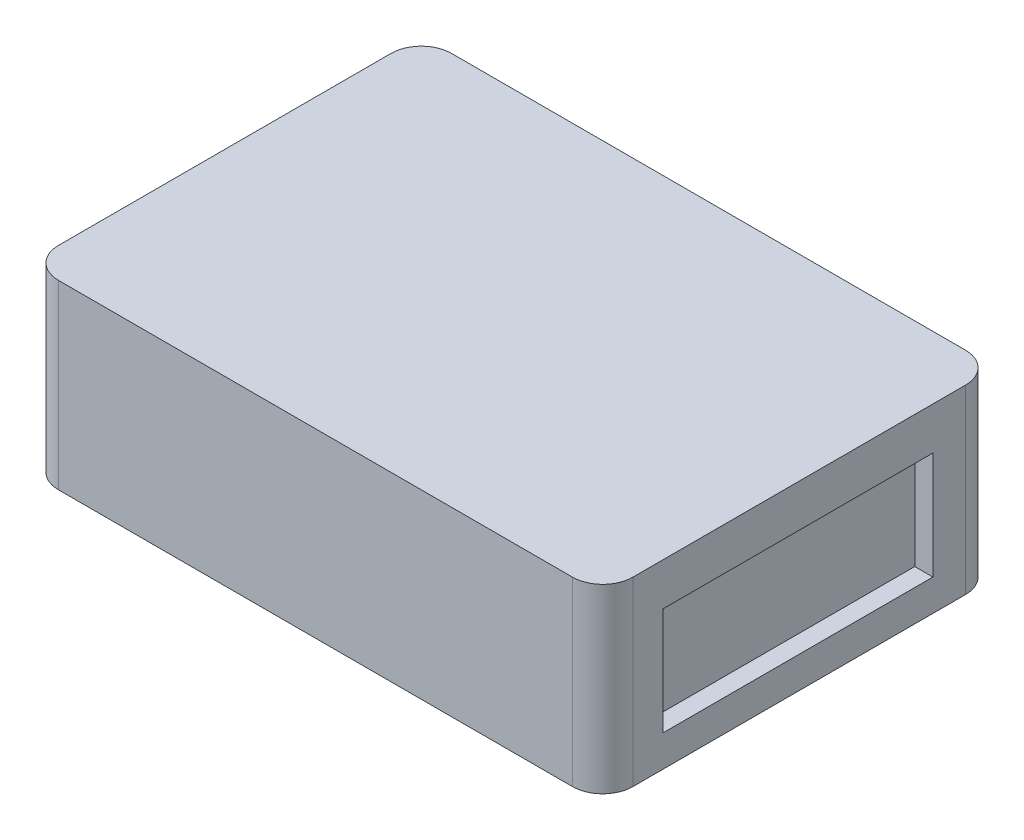
ISO-10303-21;
HEADER;
FILE_DESCRIPTION(('STEP AP214'),'2;1');
FILE_NAME('part.step','',(''),(''),'','','');
FILE_SCHEMA(('AUTOMOTIVE_DESIGN { 1 0 10303 214 1 1 1 1 }'));
ENDSEC;
DATA;
#1=APPLICATION_CONTEXT('core data for automotive mechanical design processes');
#2=APPLICATION_PROTOCOL_DEFINITION('international standard','automotive_design',2000,#1);
#3=PRODUCT_CONTEXT('',#1,'mechanical');
#4=PRODUCT('Part','Part','',(#3));
#5=PRODUCT_RELATED_PRODUCT_CATEGORY('part','',(#4));
#6=PRODUCT_DEFINITION_FORMATION('','',#4);
#7=PRODUCT_DEFINITION_CONTEXT('part definition',#1,'design');
#8=PRODUCT_DEFINITION('design','',#6,#7);
#9=PRODUCT_DEFINITION_SHAPE('','',#8);
#10=(LENGTH_UNIT() NAMED_UNIT(*) SI_UNIT(.MILLI.,.METRE.));
#11=(NAMED_UNIT(*) PLANE_ANGLE_UNIT() SI_UNIT($,.RADIAN.));
#12=(NAMED_UNIT(*) SI_UNIT($,.STERADIAN.) SOLID_ANGLE_UNIT());
#13=UNCERTAINTY_MEASURE_WITH_UNIT(LENGTH_MEASURE(1.E-05),#10,'distance_accuracy_value','');
#14=(GEOMETRIC_REPRESENTATION_CONTEXT(3) GLOBAL_UNCERTAINTY_ASSIGNED_CONTEXT((#13)) GLOBAL_UNIT_ASSIGNED_CONTEXT((#10,
#11,#12)) REPRESENTATION_CONTEXT('',''));
#15=CARTESIAN_POINT('',(0.,0.,0.));
#16=DIRECTION('',(0.,0.,1.));
#17=DIRECTION('',(1.,0.,0.));
#18=AXIS2_PLACEMENT_3D('',#15,#16,#17);
#19=CARTESIAN_POINT('',(47.5,30.,32.5));
#20=DIRECTION('',(-1.,0.,0.));
#21=DIRECTION('',(0.,0.,1.));
#22=AXIS2_PLACEMENT_3D('',#19,#20,#21);
#23=PLANE('',#22);
#24=DIRECTION('',(0.,0.,-1.));
#25=VECTOR('',#24,1.);
#26=CARTESIAN_POINT('',(47.5,5.21036770434952,22.5224648724796));
#27=LINE('',#26,#25);
#28=CARTESIAN_POINT('',(47.5,5.21036770434952,22.5224648724796));
#29=VERTEX_POINT('',#28);
#30=CARTESIAN_POINT('',(47.5,5.21036770434952,-22.1001857617545));
#31=VERTEX_POINT('',#30);
#32=EDGE_CURVE('E161',#29,#31,#27,.T.);
#33=ORIENTED_EDGE('',*,*,#32,.F.);
#34=DIRECTION('',(0.,-1.,0.));
#35=VECTOR('',#34,1.);
#36=CARTESIAN_POINT('',(47.5,22.9727820344815,22.5224648724796));
#37=LINE('',#36,#35);
#38=CARTESIAN_POINT('',(47.5,22.9727820344815,22.5224648724796));
#39=VERTEX_POINT('',#38);
#40=EDGE_CURVE('E58',#39,#29,#37,.T.);
#41=ORIENTED_EDGE('',*,*,#40,.F.);
#42=DIRECTION('',(0.,0.,1.));
#43=VECTOR('',#42,1.);
#44=CARTESIAN_POINT('',(47.5,22.9727820344815,22.5224648724796));
#45=LINE('',#44,#43);
#46=CARTESIAN_POINT('',(47.5,22.9727820344815,-22.1001857617545));
#47=VERTEX_POINT('',#46);
#48=EDGE_CURVE('E152',#47,#39,#45,.T.);
#49=ORIENTED_EDGE('',*,*,#48,.F.);
#50=DIRECTION('',(0.,1.,0.));
#51=VECTOR('',#50,1.);
#52=CARTESIAN_POINT('',(47.5,22.9727820344815,-22.1001857617545));
#53=LINE('',#52,#51);
#54=EDGE_CURVE('E155',#31,#47,#53,.T.);
#55=ORIENTED_EDGE('',*,*,#54,.F.);
#56=EDGE_LOOP('',(#33,#41,#49,#55));
#57=FACE_BOUND('',#56,.T.);
#58=DIRECTION('',(0.,0.,-1.));
#59=VECTOR('',#58,1.);
#60=CARTESIAN_POINT('',(47.5,0.,32.5));
#61=LINE('',#60,#59);
#62=CARTESIAN_POINT('',(47.5,0.,27.5));
#63=VERTEX_POINT('',#62);
#64=CARTESIAN_POINT('',(47.5,0.,-27.5));
#65=VERTEX_POINT('',#64);
#66=EDGE_CURVE('E192',#63,#65,#61,.T.);
#67=ORIENTED_EDGE('',*,*,#66,.T.);
#68=DIRECTION('',(0.,-1.,0.));
#69=VECTOR('',#68,1.);
#70=CARTESIAN_POINT('',(47.5,30.,-27.5));
#71=LINE('',#70,#69);
#72=CARTESIAN_POINT('',(47.5,30.,-27.5));
#73=VERTEX_POINT('',#72);
#74=EDGE_CURVE('E245',#65,#73,#71,.F.);
#75=ORIENTED_EDGE('',*,*,#74,.T.);
#76=DIRECTION('',(0.,0.,-1.));
#77=VECTOR('',#76,1.);
#78=CARTESIAN_POINT('',(47.5,30.,32.5));
#79=LINE('',#78,#77);
#80=CARTESIAN_POINT('',(47.5,30.,27.5));
#81=VERTEX_POINT('',#80);
#82=EDGE_CURVE('E195',#81,#73,#79,.T.);
#83=ORIENTED_EDGE('',*,*,#82,.F.);
#84=DIRECTION('',(0.,-1.,0.));
#85=VECTOR('',#84,1.);
#86=CARTESIAN_POINT('',(47.5,30.,27.5));
#87=LINE('',#86,#85);
#88=EDGE_CURVE('E242',#81,#63,#87,.T.);
#89=ORIENTED_EDGE('',*,*,#88,.T.);
#90=EDGE_LOOP('',(#67,#75,#83,#89));
#91=FACE_BOUND('',#90,.T.);
#92=ADVANCED_FACE('F43',(#57,#91),#23,.F.);
#93=CARTESIAN_POINT('',(-47.5,30.,-32.5));
#94=DIRECTION('',(0.,0.,1.));
#95=DIRECTION('',(1.,0.,0.));
#96=AXIS2_PLACEMENT_3D('',#93,#94,#95);
#97=PLANE('',#96);
#98=DIRECTION('',(-1.,0.,0.));
#99=VECTOR('',#98,1.);
#100=CARTESIAN_POINT('',(-47.5,0.,-32.5));
#101=LINE('',#100,#99);
#102=CARTESIAN_POINT('',(42.5,0.,-32.5));
#103=VERTEX_POINT('',#102);
#104=CARTESIAN_POINT('',(-42.5,0.,-32.5));
#105=VERTEX_POINT('',#104);
#106=EDGE_CURVE('E210',#103,#105,#101,.T.);
#107=ORIENTED_EDGE('',*,*,#106,.T.);
#108=DIRECTION('',(0.,-1.,0.));
#109=VECTOR('',#108,1.);
#110=CARTESIAN_POINT('',(-42.5,30.,-32.5));
#111=LINE('',#110,#109);
#112=CARTESIAN_POINT('',(-42.5,30.,-32.5));
#113=VERTEX_POINT('',#112);
#114=EDGE_CURVE('E232',#105,#113,#111,.F.);
#115=ORIENTED_EDGE('',*,*,#114,.T.);
#116=DIRECTION('',(-1.,0.,0.));
#117=VECTOR('',#116,1.);
#118=CARTESIAN_POINT('',(-47.5,30.,-32.5));
#119=LINE('',#118,#117);
#120=CARTESIAN_POINT('',(42.5,30.,-32.5));
#121=VERTEX_POINT('',#120);
#122=EDGE_CURVE('E198',#121,#113,#119,.T.);
#123=ORIENTED_EDGE('',*,*,#122,.F.);
#124=DIRECTION('',(0.,-1.,0.));
#125=VECTOR('',#124,1.);
#126=CARTESIAN_POINT('',(42.5,30.,-32.5));
#127=LINE('',#126,#125);
#128=EDGE_CURVE('E229',#121,#103,#127,.T.);
#129=ORIENTED_EDGE('',*,*,#128,.T.);
#130=EDGE_LOOP('',(#107,#115,#123,#129));
#131=FACE_BOUND('',#130,.T.);
#132=ADVANCED_FACE('F272',(#131),#97,.F.);
#133=CARTESIAN_POINT('',(-47.5,30.,32.5));
#134=DIRECTION('',(1.,0.,0.));
#135=DIRECTION('',(0.,0.,-1.));
#136=AXIS2_PLACEMENT_3D('',#133,#134,#135);
#137=PLANE('',#136);
#138=DIRECTION('',(0.,0.,1.));
#139=VECTOR('',#138,1.);
#140=CARTESIAN_POINT('',(-47.5,30.,32.5));
#141=LINE('',#140,#139);
#142=CARTESIAN_POINT('',(-47.5,30.,-27.5));
#143=VERTEX_POINT('',#142);
#144=CARTESIAN_POINT('',(-47.5,30.,27.5));
#145=VERTEX_POINT('',#144);
#146=EDGE_CURVE('E202',#143,#145,#141,.T.);
#147=ORIENTED_EDGE('',*,*,#146,.F.);
#148=DIRECTION('',(0.,-1.,0.));
#149=VECTOR('',#148,1.);
#150=CARTESIAN_POINT('',(-47.5,30.,-27.5));
#151=LINE('',#150,#149);
#152=CARTESIAN_POINT('',(-47.5,0.,-27.5));
#153=VERTEX_POINT('',#152);
#154=EDGE_CURVE('E218',#143,#153,#151,.T.);
#155=ORIENTED_EDGE('',*,*,#154,.T.);
#156=DIRECTION('',(0.,0.,1.));
#157=VECTOR('',#156,1.);
#158=CARTESIAN_POINT('',(-47.5,0.,32.5));
#159=LINE('',#158,#157);
#160=CARTESIAN_POINT('',(-47.5,0.,27.5));
#161=VERTEX_POINT('',#160);
#162=EDGE_CURVE('E213',#153,#161,#159,.T.);
#163=ORIENTED_EDGE('',*,*,#162,.T.);
#164=DIRECTION('',(0.,-1.,0.));
#165=VECTOR('',#164,1.);
#166=CARTESIAN_POINT('',(-47.5,30.,27.5));
#167=LINE('',#166,#165);
#168=EDGE_CURVE('E207',#161,#145,#167,.F.);
#169=ORIENTED_EDGE('',*,*,#168,.T.);
#170=EDGE_LOOP('',(#147,#155,#163,#169));
#171=FACE_BOUND('',#170,.T.);
#172=ADVANCED_FACE('F280',(#171),#137,.F.);
#173=CARTESIAN_POINT('',(-47.5,30.,32.5));
#174=DIRECTION('',(0.,0.,-1.));
#175=DIRECTION('',(-1.,0.,0.));
#176=AXIS2_PLACEMENT_3D('',#173,#174,#175);
#177=PLANE('',#176);
#178=DIRECTION('',(1.,0.,0.));
#179=VECTOR('',#178,1.);
#180=CARTESIAN_POINT('',(-47.5,0.,32.5));
#181=LINE('',#180,#179);
#182=CARTESIAN_POINT('',(-42.5,0.,32.5));
#183=VERTEX_POINT('',#182);
#184=CARTESIAN_POINT('',(42.5,0.,32.5));
#185=VERTEX_POINT('',#184);
#186=EDGE_CURVE('E199',#183,#185,#181,.T.);
#187=ORIENTED_EDGE('',*,*,#186,.T.);
#188=DIRECTION('',(0.,-1.,0.));
#189=VECTOR('',#188,1.);
#190=CARTESIAN_POINT('',(42.5,30.,32.5));
#191=LINE('',#190,#189);
#192=CARTESIAN_POINT('',(42.5,30.,32.5));
#193=VERTEX_POINT('',#192);
#194=EDGE_CURVE('E11',#185,#193,#191,.F.);
#195=ORIENTED_EDGE('',*,*,#194,.T.);
#196=DIRECTION('',(1.,0.,0.));
#197=VECTOR('',#196,1.);
#198=CARTESIAN_POINT('',(-47.5,30.,32.5));
#199=LINE('',#198,#197);
#200=CARTESIAN_POINT('',(-42.5,30.,32.5));
#201=VERTEX_POINT('',#200);
#202=EDGE_CURVE('E205',#201,#193,#199,.T.);
#203=ORIENTED_EDGE('',*,*,#202,.F.);
#204=DIRECTION('',(0.,-1.,0.));
#205=VECTOR('',#204,1.);
#206=CARTESIAN_POINT('',(-42.5,30.,32.5));
#207=LINE('',#206,#205);
#208=EDGE_CURVE('E51',#201,#183,#207,.T.);
#209=ORIENTED_EDGE('',*,*,#208,.T.);
#210=EDGE_LOOP('',(#187,#195,#203,#209));
#211=FACE_BOUND('',#210,.T.);
#212=ADVANCED_FACE('F249',(#211),#177,.F.);
#213=CARTESIAN_POINT('',(0.,30.,0.));
#214=DIRECTION('',(0.,-1.,0.));
#215=DIRECTION('',(0.,0.,-1.));
#216=AXIS2_PLACEMENT_3D('',#213,#214,#215);
#217=PLANE('',#216);
#218=ORIENTED_EDGE('',*,*,#122,.T.);
#219=CARTESIAN_POINT('',(-42.5,30.,-27.5));
#220=DIRECTION('',(0.,-1.,0.));
#221=DIRECTION('',(0.,0.,-1.));
#222=AXIS2_PLACEMENT_3D('',#219,#220,#221);
#223=CIRCLE('',#222,5.);
#224=EDGE_CURVE('E240',#113,#143,#223,.F.);
#225=ORIENTED_EDGE('',*,*,#224,.T.);
#226=ORIENTED_EDGE('',*,*,#146,.T.);
#227=CARTESIAN_POINT('',(-42.5,30.,27.5));
#228=DIRECTION('',(0.,-1.,0.));
#229=DIRECTION('',(0.,0.,-1.));
#230=AXIS2_PLACEMENT_3D('',#227,#228,#229);
#231=CIRCLE('',#230,5.);
#232=EDGE_CURVE('E234',#145,#201,#231,.F.);
#233=ORIENTED_EDGE('',*,*,#232,.T.);
#234=ORIENTED_EDGE('',*,*,#202,.T.);
#235=CARTESIAN_POINT('',(42.5,30.,27.5));
#236=DIRECTION('',(0.,-1.,0.));
#237=DIRECTION('',(0.,0.,-1.));
#238=AXIS2_PLACEMENT_3D('',#235,#236,#237);
#239=CIRCLE('',#238,5.);
#240=EDGE_CURVE('E236',#193,#81,#239,.F.);
#241=ORIENTED_EDGE('',*,*,#240,.T.);
#242=ORIENTED_EDGE('',*,*,#82,.T.);
#243=CARTESIAN_POINT('',(42.5,30.,-27.5));
#244=DIRECTION('',(0.,-1.,0.));
#245=DIRECTION('',(0.,0.,-1.));
#246=AXIS2_PLACEMENT_3D('',#243,#244,#245);
#247=CIRCLE('',#246,5.);
#248=EDGE_CURVE('E238',#73,#121,#247,.F.);
#249=ORIENTED_EDGE('',*,*,#248,.T.);
#250=EDGE_LOOP('',(#218,#225,#226,#233,#234,#241,#242,#249));
#251=FACE_BOUND('',#250,.T.);
#252=ADVANCED_FACE('F265',(#251),#217,.F.);
#253=CARTESIAN_POINT('',(0.,0.,0.));
#254=DIRECTION('',(0.,-1.,0.));
#255=DIRECTION('',(0.,0.,-1.));
#256=AXIS2_PLACEMENT_3D('',#253,#254,#255);
#257=PLANE('',#256);
#258=CARTESIAN_POINT('',(-40.6617200844704,0.,-23.));
#259=DIRECTION('',(0.,-1.,0.));
#260=DIRECTION('',(0.,0.,-1.));
#261=AXIS2_PLACEMENT_3D('',#258,#259,#260);
#262=CIRCLE('',#261,1.5);
#263=CARTESIAN_POINT('',(-40.6617200844704,0.,-24.5));
#264=VERTEX_POINT('',#263);
#265=EDGE_CURVE('E177',#264,#264,#262,.T.);
#266=ORIENTED_EDGE('',*,*,#265,.F.);
#267=EDGE_LOOP('',(#266));
#268=FACE_BOUND('',#267,.T.);
#269=CARTESIAN_POINT('',(14.3382799155296,0.,23.));
#270=DIRECTION('',(0.,-1.,0.));
#271=DIRECTION('',(0.,0.,-1.));
#272=AXIS2_PLACEMENT_3D('',#269,#270,#271);
#273=CIRCLE('',#272,1.5);
#274=CARTESIAN_POINT('',(14.3382799155296,0.,21.5));
#275=VERTEX_POINT('',#274);
#276=EDGE_CURVE('E184',#275,#275,#273,.T.);
#277=ORIENTED_EDGE('',*,*,#276,.F.);
#278=EDGE_LOOP('',(#277));
#279=FACE_BOUND('',#278,.T.);
#280=CARTESIAN_POINT('',(14.3382799155296,0.,-23.));
#281=DIRECTION('',(0.,-1.,0.));
#282=DIRECTION('',(0.,0.,-1.));
#283=AXIS2_PLACEMENT_3D('',#280,#281,#282);
#284=CIRCLE('',#283,1.5);
#285=CARTESIAN_POINT('',(14.3382799155296,0.,-24.5));
#286=VERTEX_POINT('',#285);
#287=EDGE_CURVE('E171',#286,#286,#284,.T.);
#288=ORIENTED_EDGE('',*,*,#287,.F.);
#289=EDGE_LOOP('',(#288));
#290=FACE_BOUND('',#289,.T.);
#291=CARTESIAN_POINT('',(-40.6617200844704,0.,23.));
#292=DIRECTION('',(0.,-1.,0.));
#293=DIRECTION('',(0.,0.,-1.));
#294=AXIS2_PLACEMENT_3D('',#291,#292,#293);
#295=CIRCLE('',#294,1.5);
#296=CARTESIAN_POINT('',(-40.6617200844704,0.,21.5));
#297=VERTEX_POINT('',#296);
#298=EDGE_CURVE('E180',#297,#297,#295,.T.);
#299=ORIENTED_EDGE('',*,*,#298,.F.);
#300=EDGE_LOOP('',(#299));
#301=FACE_BOUND('',#300,.T.);
#302=ORIENTED_EDGE('',*,*,#162,.F.);
#303=CARTESIAN_POINT('',(-42.5,0.,-27.5));
#304=DIRECTION('',(0.,-1.,0.));
#305=DIRECTION('',(0.,0.,-1.));
#306=AXIS2_PLACEMENT_3D('',#303,#304,#305);
#307=CIRCLE('',#306,5.);
#308=EDGE_CURVE('E227',#153,#105,#307,.T.);
#309=ORIENTED_EDGE('',*,*,#308,.T.);
#310=ORIENTED_EDGE('',*,*,#106,.F.);
#311=CARTESIAN_POINT('',(42.5,0.,-27.5));
#312=DIRECTION('',(0.,-1.,0.));
#313=DIRECTION('',(0.,0.,-1.));
#314=AXIS2_PLACEMENT_3D('',#311,#312,#313);
#315=CIRCLE('',#314,5.);
#316=EDGE_CURVE('E225',#103,#65,#315,.T.);
#317=ORIENTED_EDGE('',*,*,#316,.T.);
#318=ORIENTED_EDGE('',*,*,#66,.F.);
#319=CARTESIAN_POINT('',(42.5,0.,27.5));
#320=DIRECTION('',(0.,-1.,0.));
#321=DIRECTION('',(0.,0.,-1.));
#322=AXIS2_PLACEMENT_3D('',#319,#320,#321);
#323=CIRCLE('',#322,5.);
#324=EDGE_CURVE('E223',#63,#185,#323,.T.);
#325=ORIENTED_EDGE('',*,*,#324,.T.);
#326=ORIENTED_EDGE('',*,*,#186,.F.);
#327=CARTESIAN_POINT('',(-42.5,0.,27.5));
#328=DIRECTION('',(0.,-1.,0.));
#329=DIRECTION('',(0.,0.,-1.));
#330=AXIS2_PLACEMENT_3D('',#327,#328,#329);
#331=CIRCLE('',#330,5.);
#332=EDGE_CURVE('E221',#183,#161,#331,.T.);
#333=ORIENTED_EDGE('',*,*,#332,.T.);
#334=EDGE_LOOP('',(#302,#309,#310,#317,#318,#325,#326,#333));
#335=FACE_BOUND('',#334,.T.);
#336=ADVANCED_FACE('F254',(#268,#279,#290,#301,#335),#257,.T.);
#337=CARTESIAN_POINT('',(-42.5,30.,-27.5));
#338=DIRECTION('',(0.,-1.,0.));
#339=DIRECTION('',(0.,0.,-1.));
#340=AXIS2_PLACEMENT_3D('',#337,#338,#339);
#341=CYLINDRICAL_SURFACE('',#340,5.);
#342=ORIENTED_EDGE('',*,*,#224,.F.);
#343=ORIENTED_EDGE('',*,*,#114,.F.);
#344=ORIENTED_EDGE('',*,*,#308,.F.);
#345=ORIENTED_EDGE('',*,*,#154,.F.);
#346=EDGE_LOOP('',(#342,#343,#344,#345));
#347=FACE_BOUND('',#346,.T.);
#348=ADVANCED_FACE('F277',(#347),#341,.T.);
#349=CARTESIAN_POINT('',(42.5,30.,-27.5));
#350=DIRECTION('',(0.,-1.,0.));
#351=DIRECTION('',(0.,0.,-1.));
#352=AXIS2_PLACEMENT_3D('',#349,#350,#351);
#353=CYLINDRICAL_SURFACE('',#352,5.);
#354=ORIENTED_EDGE('',*,*,#248,.F.);
#355=ORIENTED_EDGE('',*,*,#74,.F.);
#356=ORIENTED_EDGE('',*,*,#316,.F.);
#357=ORIENTED_EDGE('',*,*,#128,.F.);
#358=EDGE_LOOP('',(#354,#355,#356,#357));
#359=FACE_BOUND('',#358,.T.);
#360=ADVANCED_FACE('F269',(#359),#353,.T.);
#361=CARTESIAN_POINT('',(42.5,30.,27.5));
#362=DIRECTION('',(0.,-1.,0.));
#363=DIRECTION('',(0.,0.,-1.));
#364=AXIS2_PLACEMENT_3D('',#361,#362,#363);
#365=CYLINDRICAL_SURFACE('',#364,5.);
#366=ORIENTED_EDGE('',*,*,#240,.F.);
#367=ORIENTED_EDGE('',*,*,#194,.F.);
#368=ORIENTED_EDGE('',*,*,#324,.F.);
#369=ORIENTED_EDGE('',*,*,#88,.F.);
#370=EDGE_LOOP('',(#366,#367,#368,#369));
#371=FACE_BOUND('',#370,.T.);
#372=ADVANCED_FACE('F259',(#371),#365,.T.);
#373=CARTESIAN_POINT('',(-42.5,30.,27.5));
#374=DIRECTION('',(0.,-1.,0.));
#375=DIRECTION('',(0.,0.,-1.));
#376=AXIS2_PLACEMENT_3D('',#373,#374,#375);
#377=CYLINDRICAL_SURFACE('',#376,5.);
#378=ORIENTED_EDGE('',*,*,#232,.F.);
#379=ORIENTED_EDGE('',*,*,#168,.F.);
#380=ORIENTED_EDGE('',*,*,#332,.F.);
#381=ORIENTED_EDGE('',*,*,#208,.F.);
#382=EDGE_LOOP('',(#378,#379,#380,#381));
#383=FACE_BOUND('',#382,.T.);
#384=ADVANCED_FACE('F45',(#383),#377,.T.);
#385=CARTESIAN_POINT('',(-40.6617200844704,10.,23.));
#386=DIRECTION('',(0.,-1.,0.));
#387=DIRECTION('',(0.,0.,-1.));
#388=AXIS2_PLACEMENT_3D('',#385,#386,#387);
#389=CYLINDRICAL_SURFACE('',#388,1.5);
#390=CARTESIAN_POINT('',(-40.6617200844704,10.,23.));
#391=DIRECTION('',(0.,-1.,0.));
#392=DIRECTION('',(0.,0.,-1.));
#393=AXIS2_PLACEMENT_3D('',#390,#391,#392);
#394=CIRCLE('',#393,1.5);
#395=CARTESIAN_POINT('',(-40.6617200844704,10.,21.5));
#396=VERTEX_POINT('',#395);
#397=EDGE_CURVE('E189',#396,#396,#394,.T.);
#398=ORIENTED_EDGE('',*,*,#397,.F.);
#399=EDGE_LOOP('',(#398));
#400=FACE_BOUND('',#399,.T.);
#401=ORIENTED_EDGE('',*,*,#298,.T.);
#402=EDGE_LOOP('',(#401));
#403=FACE_BOUND('',#402,.T.);
#404=ADVANCED_FACE('F283',(#400,#403),#389,.F.);
#405=CARTESIAN_POINT('',(-40.6617200844704,10.,23.));
#406=DIRECTION('',(0.,-1.,0.));
#407=DIRECTION('',(0.,0.,-1.));
#408=AXIS2_PLACEMENT_3D('',#405,#406,#407);
#409=PLANE('',#408);
#410=ORIENTED_EDGE('',*,*,#397,.T.);
#411=EDGE_LOOP('',(#410));
#412=FACE_BOUND('',#411,.T.);
#413=ADVANCED_FACE('F289',(#412),#409,.T.);
#414=CARTESIAN_POINT('',(14.3382799155296,10.,-23.));
#415=DIRECTION('',(0.,-1.,0.));
#416=DIRECTION('',(0.,0.,-1.));
#417=AXIS2_PLACEMENT_3D('',#414,#415,#416);
#418=CYLINDRICAL_SURFACE('',#417,1.5);
#419=CARTESIAN_POINT('',(14.3382799155296,10.,-23.));
#420=DIRECTION('',(0.,-1.,0.));
#421=DIRECTION('',(0.,0.,-1.));
#422=AXIS2_PLACEMENT_3D('',#419,#420,#421);
#423=CIRCLE('',#422,1.5);
#424=CARTESIAN_POINT('',(14.3382799155296,10.,-24.5));
#425=VERTEX_POINT('',#424);
#426=EDGE_CURVE('E167',#425,#425,#423,.T.);
#427=ORIENTED_EDGE('',*,*,#426,.F.);
#428=EDGE_LOOP('',(#427));
#429=FACE_BOUND('',#428,.T.);
#430=ORIENTED_EDGE('',*,*,#287,.T.);
#431=EDGE_LOOP('',(#430));
#432=FACE_BOUND('',#431,.T.);
#433=ADVANCED_FACE('F336',(#429,#432),#418,.F.);
#434=CARTESIAN_POINT('',(14.3382799155296,10.,-23.));
#435=DIRECTION('',(0.,-1.,0.));
#436=DIRECTION('',(0.,0.,-1.));
#437=AXIS2_PLACEMENT_3D('',#434,#435,#436);
#438=PLANE('',#437);
#439=ORIENTED_EDGE('',*,*,#426,.T.);
#440=EDGE_LOOP('',(#439));
#441=FACE_BOUND('',#440,.T.);
#442=ADVANCED_FACE('F346',(#441),#438,.T.);
#443=CARTESIAN_POINT('',(14.3382799155296,10.,23.));
#444=DIRECTION('',(0.,-1.,0.));
#445=DIRECTION('',(0.,0.,-1.));
#446=AXIS2_PLACEMENT_3D('',#443,#444,#445);
#447=CYLINDRICAL_SURFACE('',#446,1.5);
#448=CARTESIAN_POINT('',(14.3382799155296,10.,23.));
#449=DIRECTION('',(0.,-1.,0.));
#450=DIRECTION('',(0.,0.,-1.));
#451=AXIS2_PLACEMENT_3D('',#448,#449,#450);
#452=CIRCLE('',#451,1.5);
#453=CARTESIAN_POINT('',(14.3382799155296,10.,21.5));
#454=VERTEX_POINT('',#453);
#455=EDGE_CURVE('E174',#454,#454,#452,.T.);
#456=ORIENTED_EDGE('',*,*,#455,.F.);
#457=EDGE_LOOP('',(#456));
#458=FACE_BOUND('',#457,.T.);
#459=ORIENTED_EDGE('',*,*,#276,.T.);
#460=EDGE_LOOP('',(#459));
#461=FACE_BOUND('',#460,.T.);
#462=ADVANCED_FACE('F356',(#458,#461),#447,.F.);
#463=CARTESIAN_POINT('',(14.3382799155296,10.,23.));
#464=DIRECTION('',(0.,-1.,0.));
#465=DIRECTION('',(0.,0.,-1.));
#466=AXIS2_PLACEMENT_3D('',#463,#464,#465);
#467=PLANE('',#466);
#468=ORIENTED_EDGE('',*,*,#455,.T.);
#469=EDGE_LOOP('',(#468));
#470=FACE_BOUND('',#469,.T.);
#471=ADVANCED_FACE('F366',(#470),#467,.T.);
#472=CARTESIAN_POINT('',(-40.6617200844704,10.,-23.));
#473=DIRECTION('',(0.,-1.,0.));
#474=DIRECTION('',(0.,0.,-1.));
#475=AXIS2_PLACEMENT_3D('',#472,#473,#474);
#476=CYLINDRICAL_SURFACE('',#475,1.5);
#477=CARTESIAN_POINT('',(-40.6617200844704,10.,-23.));
#478=DIRECTION('',(0.,-1.,0.));
#479=DIRECTION('',(0.,0.,-1.));
#480=AXIS2_PLACEMENT_3D('',#477,#478,#479);
#481=CIRCLE('',#480,1.5);
#482=CARTESIAN_POINT('',(-40.6617200844704,10.,-24.5));
#483=VERTEX_POINT('',#482);
#484=EDGE_CURVE('E181',#483,#483,#481,.T.);
#485=ORIENTED_EDGE('',*,*,#484,.F.);
#486=EDGE_LOOP('',(#485));
#487=FACE_BOUND('',#486,.T.);
#488=ORIENTED_EDGE('',*,*,#265,.T.);
#489=EDGE_LOOP('',(#488));
#490=FACE_BOUND('',#489,.T.);
#491=ADVANCED_FACE('F376',(#487,#490),#476,.F.);
#492=CARTESIAN_POINT('',(-40.6617200844704,10.,-23.));
#493=DIRECTION('',(0.,-1.,0.));
#494=DIRECTION('',(0.,0.,-1.));
#495=AXIS2_PLACEMENT_3D('',#492,#493,#494);
#496=PLANE('',#495);
#497=ORIENTED_EDGE('',*,*,#484,.T.);
#498=EDGE_LOOP('',(#497));
#499=FACE_BOUND('',#498,.T.);
#500=ADVANCED_FACE('F386',(#499),#496,.T.);
#501=CARTESIAN_POINT('',(44.5,22.9727820344815,22.5224648724796));
#502=DIRECTION('',(0.,0.,1.));
#503=DIRECTION('',(1.,0.,0.));
#504=AXIS2_PLACEMENT_3D('',#501,#502,#503);
#505=PLANE('',#504);
#506=ORIENTED_EDGE('',*,*,#40,.T.);
#507=DIRECTION('',(1.,0.,0.));
#508=VECTOR('',#507,1.);
#509=CARTESIAN_POINT('',(44.5,5.21036770434952,22.5224648724796));
#510=LINE('',#509,#508);
#511=CARTESIAN_POINT('',(44.5,5.21036770434952,22.5224648724796));
#512=VERTEX_POINT('',#511);
#513=EDGE_CURVE('E130',#512,#29,#510,.T.);
#514=ORIENTED_EDGE('',*,*,#513,.F.);
#515=DIRECTION('',(0.,-1.,0.));
#516=VECTOR('',#515,1.);
#517=CARTESIAN_POINT('',(44.5,22.9727820344815,22.5224648724796));
#518=LINE('',#517,#516);
#519=CARTESIAN_POINT('',(44.5,22.9727820344815,22.5224648724796));
#520=VERTEX_POINT('',#519);
#521=EDGE_CURVE('E134',#520,#512,#518,.T.);
#522=ORIENTED_EDGE('',*,*,#521,.F.);
#523=DIRECTION('',(1.,0.,0.));
#524=VECTOR('',#523,1.);
#525=CARTESIAN_POINT('',(44.5,22.9727820344815,22.5224648724796));
#526=LINE('',#525,#524);
#527=EDGE_CURVE('E165',#520,#39,#526,.T.);
#528=ORIENTED_EDGE('',*,*,#527,.T.);
#529=EDGE_LOOP('',(#506,#514,#522,#528));
#530=FACE_BOUND('',#529,.T.);
#531=ADVANCED_FACE('F132',(#530),#505,.F.);
#532=CARTESIAN_POINT('',(44.5,22.9727820344815,22.5224648724796));
#533=DIRECTION('',(0.,1.,0.));
#534=DIRECTION('',(0.,0.,1.));
#535=AXIS2_PLACEMENT_3D('',#532,#533,#534);
#536=PLANE('',#535);
#537=ORIENTED_EDGE('',*,*,#48,.T.);
#538=ORIENTED_EDGE('',*,*,#527,.F.);
#539=DIRECTION('',(0.,0.,1.));
#540=VECTOR('',#539,1.);
#541=CARTESIAN_POINT('',(44.5,22.9727820344815,22.5224648724796));
#542=LINE('',#541,#540);
#543=CARTESIAN_POINT('',(44.5,22.9727820344815,-22.1001857617545));
#544=VERTEX_POINT('',#543);
#545=EDGE_CURVE('E140',#544,#520,#542,.T.);
#546=ORIENTED_EDGE('',*,*,#545,.F.);
#547=DIRECTION('',(1.,0.,0.));
#548=VECTOR('',#547,1.);
#549=CARTESIAN_POINT('',(44.5,22.9727820344815,-22.1001857617545));
#550=LINE('',#549,#548);
#551=EDGE_CURVE('E168',#544,#47,#550,.T.);
#552=ORIENTED_EDGE('',*,*,#551,.T.);
#553=EDGE_LOOP('',(#537,#538,#546,#552));
#554=FACE_BOUND('',#553,.T.);
#555=ADVANCED_FACE('F403',(#554),#536,.F.);
#556=CARTESIAN_POINT('',(44.5,22.9727820344815,-22.1001857617545));
#557=DIRECTION('',(0.,0.,-1.));
#558=DIRECTION('',(-1.,0.,0.));
#559=AXIS2_PLACEMENT_3D('',#556,#557,#558);
#560=PLANE('',#559);
#561=ORIENTED_EDGE('',*,*,#54,.T.);
#562=ORIENTED_EDGE('',*,*,#551,.F.);
#563=DIRECTION('',(0.,1.,0.));
#564=VECTOR('',#563,1.);
#565=CARTESIAN_POINT('',(44.5,22.9727820344815,-22.1001857617545));
#566=LINE('',#565,#564);
#567=CARTESIAN_POINT('',(44.5,5.21036770434952,-22.1001857617545));
#568=VERTEX_POINT('',#567);
#569=EDGE_CURVE('E148',#568,#544,#566,.T.);
#570=ORIENTED_EDGE('',*,*,#569,.F.);
#571=DIRECTION('',(1.,0.,0.));
#572=VECTOR('',#571,1.);
#573=CARTESIAN_POINT('',(44.5,5.21036770434952,-22.1001857617545));
#574=LINE('',#573,#572);
#575=EDGE_CURVE('E139',#568,#31,#574,.T.);
#576=ORIENTED_EDGE('',*,*,#575,.T.);
#577=EDGE_LOOP('',(#561,#562,#570,#576));
#578=FACE_BOUND('',#577,.T.);
#579=ADVANCED_FACE('F412',(#578),#560,.F.);
#580=CARTESIAN_POINT('',(44.5,5.21036770434952,22.5224648724796));
#581=DIRECTION('',(0.,-1.,0.));
#582=DIRECTION('',(0.,0.,-1.));
#583=AXIS2_PLACEMENT_3D('',#580,#581,#582);
#584=PLANE('',#583);
#585=ORIENTED_EDGE('',*,*,#32,.T.);
#586=ORIENTED_EDGE('',*,*,#575,.F.);
#587=DIRECTION('',(0.,0.,-1.));
#588=VECTOR('',#587,1.);
#589=CARTESIAN_POINT('',(44.5,5.21036770434952,22.5224648724796));
#590=LINE('',#589,#588);
#591=EDGE_CURVE('E143',#512,#568,#590,.T.);
#592=ORIENTED_EDGE('',*,*,#591,.F.);
#593=ORIENTED_EDGE('',*,*,#513,.T.);
#594=EDGE_LOOP('',(#585,#586,#592,#593));
#595=FACE_BOUND('',#594,.T.);
#596=ADVANCED_FACE('F144',(#595),#584,.F.);
#597=CARTESIAN_POINT('',(44.5,0.,0.));
#598=DIRECTION('',(1.,0.,0.));
#599=DIRECTION('',(0.,0.,-1.));
#600=AXIS2_PLACEMENT_3D('',#597,#598,#599);
#601=PLANE('',#600);
#602=ORIENTED_EDGE('',*,*,#521,.T.);
#603=ORIENTED_EDGE('',*,*,#591,.T.);
#604=ORIENTED_EDGE('',*,*,#569,.T.);
#605=ORIENTED_EDGE('',*,*,#545,.T.);
#606=EDGE_LOOP('',(#602,#603,#604,#605));
#607=FACE_BOUND('',#606,.T.);
#608=ADVANCED_FACE('F150',(#607),#601,.T.);
#609=CLOSED_SHELL('',(#92,#132,#172,#212,#252,#336,#348,#360,#372,#384,#404,#413,#433,#442,#462,
#471,#491,#500,#531,#555,#579,#596,#608));
#610=MANIFOLD_SOLID_BREP('B2',#609);
#611=ADVANCED_BREP_SHAPE_REPRESENTATION('',(#18,#610),#14);
#612=SHAPE_DEFINITION_REPRESENTATION(#9,#611);
ENDSEC;
END-ISO-10303-21;
